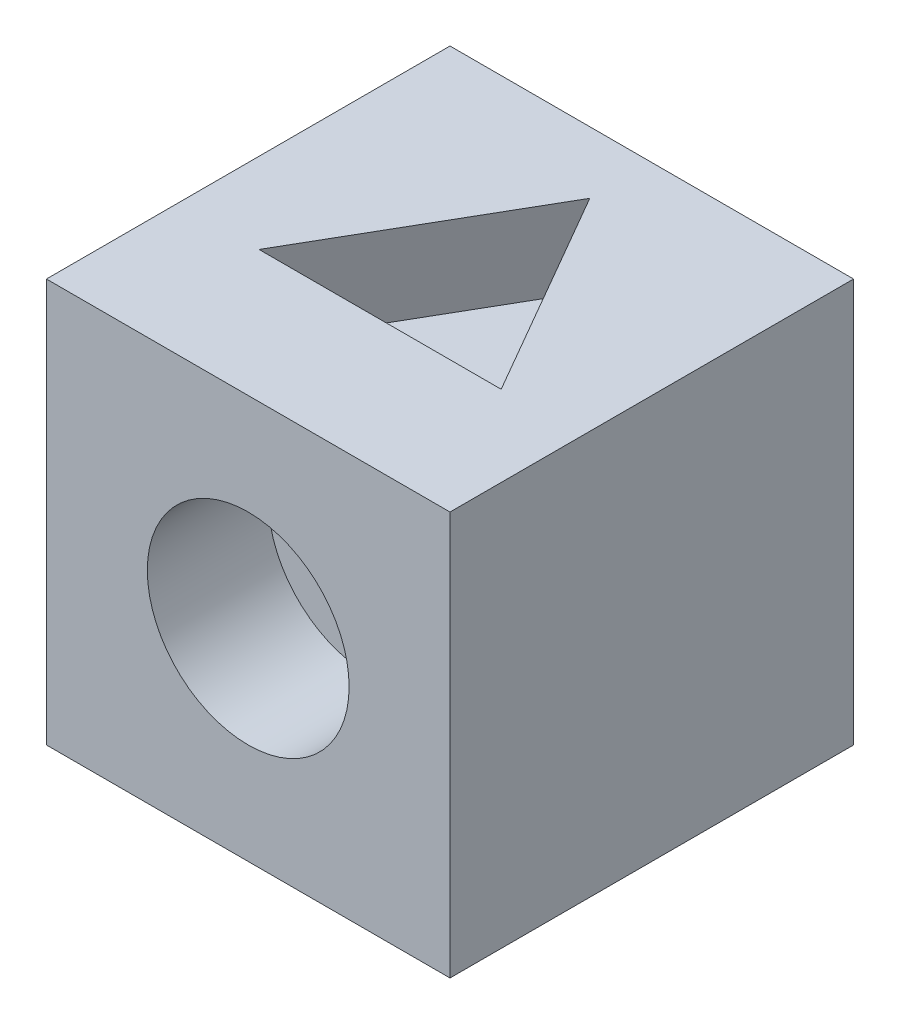
ISO-10303-21;
HEADER;
FILE_DESCRIPTION(('STEP AP214'),'2;1');
FILE_NAME('part.step','',(''),(''),'','','');
FILE_SCHEMA(('AUTOMOTIVE_DESIGN { 1 0 10303 214 1 1 1 1 }'));
ENDSEC;
DATA;
#1=APPLICATION_CONTEXT('core data for automotive mechanical design processes');
#2=APPLICATION_PROTOCOL_DEFINITION('international standard','automotive_design',2000,#1);
#3=PRODUCT_CONTEXT('',#1,'mechanical');
#4=PRODUCT('Part','Part','',(#3));
#5=PRODUCT_RELATED_PRODUCT_CATEGORY('part','',(#4));
#6=PRODUCT_DEFINITION_FORMATION('','',#4);
#7=PRODUCT_DEFINITION_CONTEXT('part definition',#1,'design');
#8=PRODUCT_DEFINITION('design','',#6,#7);
#9=PRODUCT_DEFINITION_SHAPE('','',#8);
#10=(LENGTH_UNIT() NAMED_UNIT(*) SI_UNIT(.MILLI.,.METRE.));
#11=(NAMED_UNIT(*) PLANE_ANGLE_UNIT() SI_UNIT($,.RADIAN.));
#12=(NAMED_UNIT(*) SI_UNIT($,.STERADIAN.) SOLID_ANGLE_UNIT());
#13=UNCERTAINTY_MEASURE_WITH_UNIT(LENGTH_MEASURE(1.E-05),#10,'distance_accuracy_value','');
#14=(GEOMETRIC_REPRESENTATION_CONTEXT(3) GLOBAL_UNCERTAINTY_ASSIGNED_CONTEXT((#13)) GLOBAL_UNIT_ASSIGNED_CONTEXT((#10,
#11,#12)) REPRESENTATION_CONTEXT('',''));
#15=CARTESIAN_POINT('',(0.,0.,0.));
#16=DIRECTION('',(0.,0.,1.));
#17=DIRECTION('',(1.,0.,0.));
#18=AXIS2_PLACEMENT_3D('',#15,#16,#17);
#19=CARTESIAN_POINT('',(50.,100.,50.));
#20=DIRECTION('',(-1.,0.,0.));
#21=DIRECTION('',(0.,0.,1.));
#22=AXIS2_PLACEMENT_3D('',#19,#20,#21);
#23=PLANE('',#22);
#24=DIRECTION('',(0.,0.,-1.));
#25=VECTOR('',#24,1.);
#26=CARTESIAN_POINT('',(50.,0.,50.));
#27=LINE('',#26,#25);
#28=CARTESIAN_POINT('',(50.,0.,50.));
#29=VERTEX_POINT('',#28);
#30=CARTESIAN_POINT('',(50.,0.,-50.));
#31=VERTEX_POINT('',#30);
#32=EDGE_CURVE('E136',#29,#31,#27,.T.);
#33=ORIENTED_EDGE('',*,*,#32,.T.);
#34=DIRECTION('',(0.,-1.,0.));
#35=VECTOR('',#34,1.);
#36=CARTESIAN_POINT('',(50.,100.,-50.));
#37=LINE('',#36,#35);
#38=CARTESIAN_POINT('',(50.,100.,-50.));
#39=VERTEX_POINT('',#38);
#40=EDGE_CURVE('E11',#39,#31,#37,.T.);
#41=ORIENTED_EDGE('',*,*,#40,.F.);
#42=DIRECTION('',(0.,0.,-1.));
#43=VECTOR('',#42,1.);
#44=CARTESIAN_POINT('',(50.,100.,50.));
#45=LINE('',#44,#43);
#46=CARTESIAN_POINT('',(50.,100.,50.));
#47=VERTEX_POINT('',#46);
#48=EDGE_CURVE('E139',#47,#39,#45,.T.);
#49=ORIENTED_EDGE('',*,*,#48,.F.);
#50=DIRECTION('',(0.,-1.,0.));
#51=VECTOR('',#50,1.);
#52=CARTESIAN_POINT('',(50.,100.,50.));
#53=LINE('',#52,#51);
#54=EDGE_CURVE('E145',#47,#29,#53,.T.);
#55=ORIENTED_EDGE('',*,*,#54,.T.);
#56=EDGE_LOOP('',(#33,#41,#49,#55));
#57=FACE_BOUND('',#56,.T.);
#58=ADVANCED_FACE('F36',(#57),#23,.F.);
#59=CARTESIAN_POINT('',(-50.,100.,-50.));
#60=DIRECTION('',(0.,0.,1.));
#61=DIRECTION('',(1.,0.,0.));
#62=AXIS2_PLACEMENT_3D('',#59,#60,#61);
#63=PLANE('',#62);
#64=DIRECTION('',(-1.,0.,0.));
#65=VECTOR('',#64,1.);
#66=CARTESIAN_POINT('',(-50.,0.,-50.));
#67=LINE('',#66,#65);
#68=CARTESIAN_POINT('',(-50.,0.,-50.));
#69=VERTEX_POINT('',#68);
#70=EDGE_CURVE('E148',#31,#69,#67,.T.);
#71=ORIENTED_EDGE('',*,*,#70,.T.);
#72=DIRECTION('',(0.,-1.,0.));
#73=VECTOR('',#72,1.);
#74=CARTESIAN_POINT('',(-50.,100.,-50.));
#75=LINE('',#74,#73);
#76=CARTESIAN_POINT('',(-50.,100.,-50.));
#77=VERTEX_POINT('',#76);
#78=EDGE_CURVE('E43',#77,#69,#75,.T.);
#79=ORIENTED_EDGE('',*,*,#78,.F.);
#80=DIRECTION('',(-1.,0.,0.));
#81=VECTOR('',#80,1.);
#82=CARTESIAN_POINT('',(-50.,100.,-50.));
#83=LINE('',#82,#81);
#84=EDGE_CURVE('E87',#39,#77,#83,.T.);
#85=ORIENTED_EDGE('',*,*,#84,.F.);
#86=ORIENTED_EDGE('',*,*,#40,.T.);
#87=EDGE_LOOP('',(#71,#79,#85,#86));
#88=FACE_BOUND('',#87,.T.);
#89=ADVANCED_FACE('F178',(#88),#63,.F.);
#90=CARTESIAN_POINT('',(-50.,100.,50.));
#91=DIRECTION('',(1.,0.,0.));
#92=DIRECTION('',(0.,0.,-1.));
#93=AXIS2_PLACEMENT_3D('',#90,#91,#92);
#94=PLANE('',#93);
#95=DIRECTION('',(0.,0.,1.));
#96=VECTOR('',#95,1.);
#97=CARTESIAN_POINT('',(-50.,0.,50.));
#98=LINE('',#97,#96);
#99=CARTESIAN_POINT('',(-50.,0.,50.));
#100=VERTEX_POINT('',#99);
#101=EDGE_CURVE('E150',#69,#100,#98,.T.);
#102=ORIENTED_EDGE('',*,*,#101,.T.);
#103=DIRECTION('',(0.,-1.,0.));
#104=VECTOR('',#103,1.);
#105=CARTESIAN_POINT('',(-50.,100.,50.));
#106=LINE('',#105,#104);
#107=CARTESIAN_POINT('',(-50.,100.,50.));
#108=VERTEX_POINT('',#107);
#109=EDGE_CURVE('E154',#108,#100,#106,.T.);
#110=ORIENTED_EDGE('',*,*,#109,.F.);
#111=DIRECTION('',(0.,0.,1.));
#112=VECTOR('',#111,1.);
#113=CARTESIAN_POINT('',(-50.,100.,50.));
#114=LINE('',#113,#112);
#115=EDGE_CURVE('E142',#77,#108,#114,.T.);
#116=ORIENTED_EDGE('',*,*,#115,.F.);
#117=ORIENTED_EDGE('',*,*,#78,.T.);
#118=EDGE_LOOP('',(#102,#110,#116,#117));
#119=FACE_BOUND('',#118,.T.);
#120=ADVANCED_FACE('F159',(#119),#94,.F.);
#121=CARTESIAN_POINT('',(-50.,100.,50.));
#122=DIRECTION('',(0.,0.,-1.));
#123=DIRECTION('',(-1.,0.,0.));
#124=AXIS2_PLACEMENT_3D('',#121,#122,#123);
#125=PLANE('',#124);
#126=CARTESIAN_POINT('',(0.,50.,50.));
#127=DIRECTION('',(0.,0.,1.));
#128=DIRECTION('',(1.,0.,0.));
#129=AXIS2_PLACEMENT_3D('',#126,#127,#128);
#130=CIRCLE('',#129,25.);
#131=CARTESIAN_POINT('',(25.,50.,50.));
#132=VERTEX_POINT('',#131);
#133=EDGE_CURVE('E131',#132,#132,#130,.T.);
#134=ORIENTED_EDGE('',*,*,#133,.F.);
#135=EDGE_LOOP('',(#134));
#136=FACE_BOUND('',#135,.T.);
#137=DIRECTION('',(1.,0.,0.));
#138=VECTOR('',#137,1.);
#139=CARTESIAN_POINT('',(-50.,0.,50.));
#140=LINE('',#139,#138);
#141=EDGE_CURVE('E80',#100,#29,#140,.T.);
#142=ORIENTED_EDGE('',*,*,#141,.T.);
#143=ORIENTED_EDGE('',*,*,#54,.F.);
#144=DIRECTION('',(1.,0.,0.));
#145=VECTOR('',#144,1.);
#146=CARTESIAN_POINT('',(-50.,100.,50.));
#147=LINE('',#146,#145);
#148=EDGE_CURVE('E59',#108,#47,#147,.T.);
#149=ORIENTED_EDGE('',*,*,#148,.F.);
#150=ORIENTED_EDGE('',*,*,#109,.T.);
#151=EDGE_LOOP('',(#142,#143,#149,#150));
#152=FACE_BOUND('',#151,.T.);
#153=ADVANCED_FACE('F167',(#136,#152),#125,.F.);
#154=CARTESIAN_POINT('',(0.,100.,0.));
#155=DIRECTION('',(0.,-1.,0.));
#156=DIRECTION('',(0.,0.,-1.));
#157=AXIS2_PLACEMENT_3D('',#154,#155,#156);
#158=PLANE('',#157);
#159=DIRECTION('',(-0.5,0.,0.866025403784438));
#160=VECTOR('',#159,1.);
#161=CARTESIAN_POINT('',(0.,100.,-34.6410161513775));
#162=LINE('',#161,#160);
#163=CARTESIAN_POINT('',(0.,100.,-34.6410161513775));
#164=VERTEX_POINT('',#163);
#165=CARTESIAN_POINT('',(-30.,100.,17.3205080756888));
#166=VERTEX_POINT('',#165);
#167=EDGE_CURVE('E123',#164,#166,#162,.T.);
#168=ORIENTED_EDGE('',*,*,#167,.F.);
#169=DIRECTION('',(-0.5,0.,-0.866025403784439));
#170=VECTOR('',#169,1.);
#171=CARTESIAN_POINT('',(30.,100.,17.3205080756888));
#172=LINE('',#171,#170);
#173=CARTESIAN_POINT('',(30.,100.,17.3205080756888));
#174=VERTEX_POINT('',#173);
#175=EDGE_CURVE('E50',#174,#164,#172,.T.);
#176=ORIENTED_EDGE('',*,*,#175,.F.);
#177=DIRECTION('',(1.,0.,0.));
#178=VECTOR('',#177,1.);
#179=CARTESIAN_POINT('',(-30.,100.,17.3205080756888));
#180=LINE('',#179,#178);
#181=EDGE_CURVE('E120',#166,#174,#180,.T.);
#182=ORIENTED_EDGE('',*,*,#181,.F.);
#183=EDGE_LOOP('',(#168,#176,#182));
#184=FACE_BOUND('',#183,.T.);
#185=ORIENTED_EDGE('',*,*,#48,.T.);
#186=ORIENTED_EDGE('',*,*,#84,.T.);
#187=ORIENTED_EDGE('',*,*,#115,.T.);
#188=ORIENTED_EDGE('',*,*,#148,.T.);
#189=EDGE_LOOP('',(#185,#186,#187,#188));
#190=FACE_BOUND('',#189,.T.);
#191=ADVANCED_FACE('F169',(#184,#190),#158,.F.);
#192=CARTESIAN_POINT('',(0.,0.,0.));
#193=DIRECTION('',(0.,-1.,0.));
#194=DIRECTION('',(0.,0.,-1.));
#195=AXIS2_PLACEMENT_3D('',#192,#193,#194);
#196=PLANE('',#195);
#197=ORIENTED_EDGE('',*,*,#32,.F.);
#198=ORIENTED_EDGE('',*,*,#141,.F.);
#199=ORIENTED_EDGE('',*,*,#101,.F.);
#200=ORIENTED_EDGE('',*,*,#70,.F.);
#201=EDGE_LOOP('',(#197,#198,#199,#200));
#202=FACE_BOUND('',#201,.T.);
#203=ADVANCED_FACE('F163',(#202),#196,.T.);
#204=CARTESIAN_POINT('',(0.,50.,20.));
#205=DIRECTION('',(0.,0.,1.));
#206=DIRECTION('',(1.,0.,0.));
#207=AXIS2_PLACEMENT_3D('',#204,#205,#206);
#208=CYLINDRICAL_SURFACE('',#207,25.);
#209=CARTESIAN_POINT('',(0.,50.,20.));
#210=DIRECTION('',(0.,0.,1.));
#211=DIRECTION('',(1.,0.,0.));
#212=AXIS2_PLACEMENT_3D('',#209,#210,#211);
#213=CIRCLE('',#212,25.);
#214=CARTESIAN_POINT('',(25.,50.,20.));
#215=VERTEX_POINT('',#214);
#216=EDGE_CURVE('E133',#215,#215,#213,.T.);
#217=ORIENTED_EDGE('',*,*,#216,.F.);
#218=EDGE_LOOP('',(#217));
#219=FACE_BOUND('',#218,.T.);
#220=ORIENTED_EDGE('',*,*,#133,.T.);
#221=EDGE_LOOP('',(#220));
#222=FACE_BOUND('',#221,.T.);
#223=ADVANCED_FACE('F201',(#219,#222),#208,.F.);
#224=CARTESIAN_POINT('',(0.,50.,20.));
#225=DIRECTION('',(0.,0.,1.));
#226=DIRECTION('',(1.,0.,0.));
#227=AXIS2_PLACEMENT_3D('',#224,#225,#226);
#228=PLANE('',#227);
#229=ORIENTED_EDGE('',*,*,#216,.T.);
#230=EDGE_LOOP('',(#229));
#231=FACE_BOUND('',#230,.T.);
#232=ADVANCED_FACE('F214',(#231),#228,.T.);
#233=CARTESIAN_POINT('',(30.,80.,17.3205080756888));
#234=DIRECTION('',(0.866025403784439,0.,-0.5));
#235=DIRECTION('',(-0.5,0.,-0.866025403784439));
#236=AXIS2_PLACEMENT_3D('',#233,#234,#235);
#237=PLANE('',#236);
#238=ORIENTED_EDGE('',*,*,#175,.T.);
#239=DIRECTION('',(0.,1.,0.));
#240=VECTOR('',#239,1.);
#241=CARTESIAN_POINT('',(0.,80.,-34.6410161513775));
#242=LINE('',#241,#240);
#243=CARTESIAN_POINT('',(0.,80.,-34.6410161513775));
#244=VERTEX_POINT('',#243);
#245=EDGE_CURVE('E101',#244,#164,#242,.T.);
#246=ORIENTED_EDGE('',*,*,#245,.F.);
#247=DIRECTION('',(-0.5,0.,-0.866025403784439));
#248=VECTOR('',#247,1.);
#249=CARTESIAN_POINT('',(30.,80.,17.3205080756888));
#250=LINE('',#249,#248);
#251=CARTESIAN_POINT('',(30.,80.,17.3205080756888));
#252=VERTEX_POINT('',#251);
#253=EDGE_CURVE('E105',#252,#244,#250,.T.);
#254=ORIENTED_EDGE('',*,*,#253,.F.);
#255=DIRECTION('',(0.,1.,0.));
#256=VECTOR('',#255,1.);
#257=CARTESIAN_POINT('',(30.,80.,17.3205080756888));
#258=LINE('',#257,#256);
#259=EDGE_CURVE('E129',#252,#174,#258,.T.);
#260=ORIENTED_EDGE('',*,*,#259,.T.);
#261=EDGE_LOOP('',(#238,#246,#254,#260));
#262=FACE_BOUND('',#261,.T.);
#263=ADVANCED_FACE('F103',(#262),#237,.F.);
#264=CARTESIAN_POINT('',(-30.,80.,17.3205080756888));
#265=DIRECTION('',(0.,0.,1.));
#266=DIRECTION('',(1.,0.,0.));
#267=AXIS2_PLACEMENT_3D('',#264,#265,#266);
#268=PLANE('',#267);
#269=ORIENTED_EDGE('',*,*,#181,.T.);
#270=ORIENTED_EDGE('',*,*,#259,.F.);
#271=DIRECTION('',(1.,0.,0.));
#272=VECTOR('',#271,1.);
#273=CARTESIAN_POINT('',(-30.,80.,17.3205080756888));
#274=LINE('',#273,#272);
#275=CARTESIAN_POINT('',(-30.,80.,17.3205080756888));
#276=VERTEX_POINT('',#275);
#277=EDGE_CURVE('E111',#276,#252,#274,.T.);
#278=ORIENTED_EDGE('',*,*,#277,.F.);
#279=DIRECTION('',(0.,1.,0.));
#280=VECTOR('',#279,1.);
#281=CARTESIAN_POINT('',(-30.,80.,17.3205080756888));
#282=LINE('',#281,#280);
#283=EDGE_CURVE('E110',#276,#166,#282,.T.);
#284=ORIENTED_EDGE('',*,*,#283,.T.);
#285=EDGE_LOOP('',(#269,#270,#278,#284));
#286=FACE_BOUND('',#285,.T.);
#287=ADVANCED_FACE('F238',(#286),#268,.F.);
#288=CARTESIAN_POINT('',(0.,80.,-34.6410161513775));
#289=DIRECTION('',(-0.866025403784438,0.,-0.5));
#290=DIRECTION('',(-0.5,0.,0.866025403784439));
#291=AXIS2_PLACEMENT_3D('',#288,#289,#290);
#292=PLANE('',#291);
#293=ORIENTED_EDGE('',*,*,#167,.T.);
#294=ORIENTED_EDGE('',*,*,#283,.F.);
#295=DIRECTION('',(-0.5,0.,0.866025403784438));
#296=VECTOR('',#295,1.);
#297=CARTESIAN_POINT('',(0.,80.,-34.6410161513775));
#298=LINE('',#297,#296);
#299=EDGE_CURVE('E114',#244,#276,#298,.T.);
#300=ORIENTED_EDGE('',*,*,#299,.F.);
#301=ORIENTED_EDGE('',*,*,#245,.T.);
#302=EDGE_LOOP('',(#293,#294,#300,#301));
#303=FACE_BOUND('',#302,.T.);
#304=ADVANCED_FACE('F115',(#303),#292,.F.);
#305=CARTESIAN_POINT('',(0.,80.,0.));
#306=DIRECTION('',(0.,1.,0.));
#307=DIRECTION('',(0.,0.,1.));
#308=AXIS2_PLACEMENT_3D('',#305,#306,#307);
#309=PLANE('',#308);
#310=ORIENTED_EDGE('',*,*,#253,.T.);
#311=ORIENTED_EDGE('',*,*,#299,.T.);
#312=ORIENTED_EDGE('',*,*,#277,.T.);
#313=EDGE_LOOP('',(#310,#311,#312));
#314=FACE_BOUND('',#313,.T.);
#315=ADVANCED_FACE('F119',(#314),#309,.T.);
#316=CLOSED_SHELL('',(#58,#89,#120,#153,#191,#203,#223,#232,#263,#287,#304,#315));
#317=MANIFOLD_SOLID_BREP('B2',#316);
#318=ADVANCED_BREP_SHAPE_REPRESENTATION('',(#18,#317),#14);
#319=SHAPE_DEFINITION_REPRESENTATION(#9,#318);
ENDSEC;
END-ISO-10303-21;
